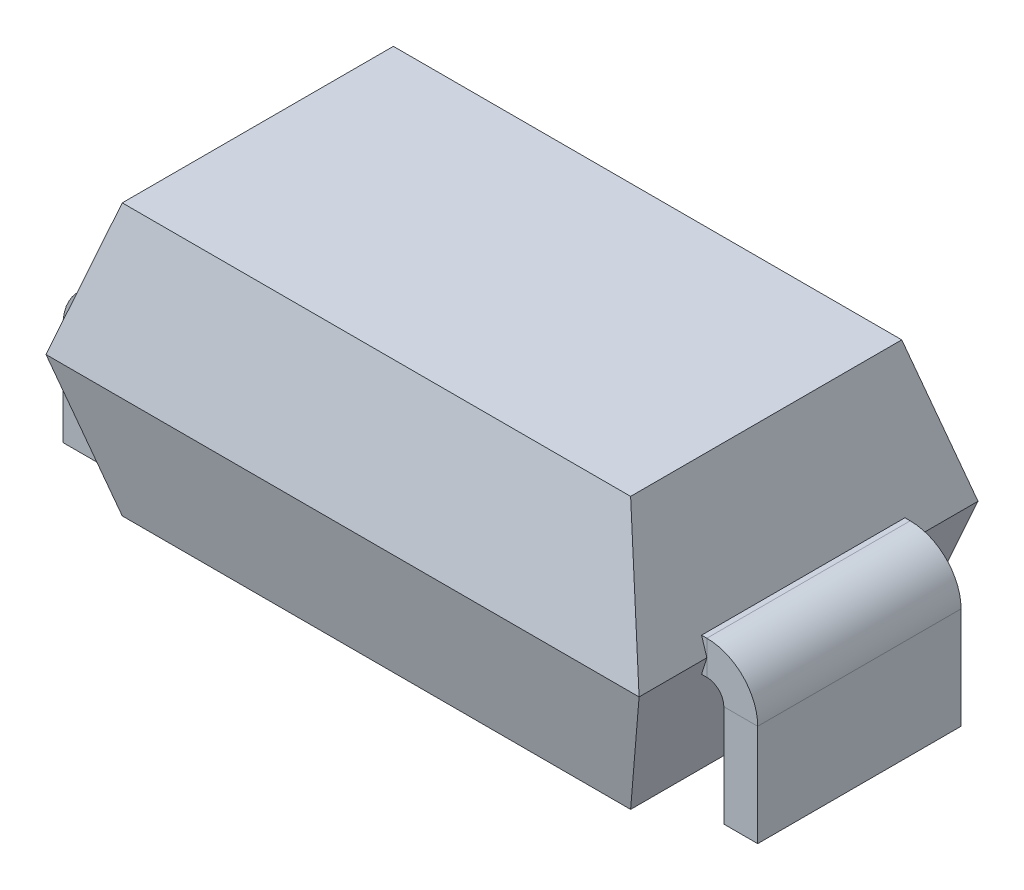
ISO-10303-21;
HEADER;
FILE_DESCRIPTION(('STEP AP214'),'2;1');
FILE_NAME('part.step','',(''),(''),'','','');
FILE_SCHEMA(('AUTOMOTIVE_DESIGN { 1 0 10303 214 1 1 1 1 }'));
ENDSEC;
DATA;
#1=APPLICATION_CONTEXT('core data for automotive mechanical design processes');
#2=APPLICATION_PROTOCOL_DEFINITION('international standard','automotive_design',2000,#1);
#3=PRODUCT_CONTEXT('',#1,'mechanical');
#4=PRODUCT('Part','Part','',(#3));
#5=PRODUCT_RELATED_PRODUCT_CATEGORY('part','',(#4));
#6=PRODUCT_DEFINITION_FORMATION('','',#4);
#7=PRODUCT_DEFINITION_CONTEXT('part definition',#1,'design');
#8=PRODUCT_DEFINITION('design','',#6,#7);
#9=PRODUCT_DEFINITION_SHAPE('','',#8);
#10=(LENGTH_UNIT() NAMED_UNIT(*) SI_UNIT(.MILLI.,.METRE.));
#11=(NAMED_UNIT(*) PLANE_ANGLE_UNIT() SI_UNIT($,.RADIAN.));
#12=(NAMED_UNIT(*) SI_UNIT($,.STERADIAN.) SOLID_ANGLE_UNIT());
#13=UNCERTAINTY_MEASURE_WITH_UNIT(LENGTH_MEASURE(1.E-05),#10,'distance_accuracy_value','');
#14=(GEOMETRIC_REPRESENTATION_CONTEXT(3) GLOBAL_UNCERTAINTY_ASSIGNED_CONTEXT((#13)) GLOBAL_UNIT_ASSIGNED_CONTEXT((#10,
#11,#12)) REPRESENTATION_CONTEXT('',''));
#15=CARTESIAN_POINT('',(0.,0.,0.));
#16=DIRECTION('',(0.,0.,1.));
#17=DIRECTION('',(1.,0.,0.));
#18=AXIS2_PLACEMENT_3D('',#15,#16,#17);
#19=CARTESIAN_POINT('',(0.,0.8,0.));
#20=DIRECTION('',(0.,1.,0.));
#21=DIRECTION('',(0.,0.,1.));
#22=AXIS2_PLACEMENT_3D('',#19,#20,#21);
#23=PLANE('',#22);
#24=DIRECTION('',(0.,0.,-1.));
#25=VECTOR('',#24,1.);
#26=CARTESIAN_POINT('',(1.5,0.8,-0.8));
#27=LINE('',#26,#25);
#28=CARTESIAN_POINT('',(1.5,0.8,0.8));
#29=VERTEX_POINT('',#28);
#30=CARTESIAN_POINT('',(1.5,0.8,-0.8));
#31=VERTEX_POINT('',#30);
#32=EDGE_CURVE('E567',#29,#31,#27,.T.);
#33=ORIENTED_EDGE('',*,*,#32,.T.);
#34=DIRECTION('',(-1.,0.,0.));
#35=VECTOR('',#34,1.);
#36=CARTESIAN_POINT('',(-1.5,0.8,-0.8));
#37=LINE('',#36,#35);
#38=CARTESIAN_POINT('',(-1.5,0.8,-0.8));
#39=VERTEX_POINT('',#38);
#40=EDGE_CURVE('E464',#31,#39,#37,.T.);
#41=ORIENTED_EDGE('',*,*,#40,.T.);
#42=DIRECTION('',(0.,0.,1.));
#43=VECTOR('',#42,1.);
#44=CARTESIAN_POINT('',(-1.5,0.8,-0.8));
#45=LINE('',#44,#43);
#46=CARTESIAN_POINT('',(-1.5,0.8,0.8));
#47=VERTEX_POINT('',#46);
#48=EDGE_CURVE('E687',#39,#47,#45,.T.);
#49=ORIENTED_EDGE('',*,*,#48,.T.);
#50=DIRECTION('',(1.,0.,0.));
#51=VECTOR('',#50,1.);
#52=CARTESIAN_POINT('',(-1.5,0.8,0.8));
#53=LINE('',#52,#51);
#54=EDGE_CURVE('E680',#47,#29,#53,.T.);
#55=ORIENTED_EDGE('',*,*,#54,.T.);
#56=EDGE_LOOP('',(#33,#41,#49,#55));
#57=FACE_BOUND('',#56,.T.);
#58=ADVANCED_FACE('F52',(#57),#23,.T.);
#59=CARTESIAN_POINT('',(-1.59430604982206,0.498220640569394,0.));
#60=DIRECTION('',(0.95447997803503,-0.298274993135946,0.));
#61=DIRECTION('',(0.298274993135946,0.95447997803503,0.));
#62=AXIS2_PLACEMENT_3D('',#59,#60,#61);
#63=PLANE('',#62);
#64=DIRECTION('',(0.,0.,1.));
#65=VECTOR('',#64,1.);
#66=CARTESIAN_POINT('',(-1.75,0.,-1.));
#67=LINE('',#66,#65);
#68=CARTESIAN_POINT('',(-1.75,0.,-1.));
#69=VERTEX_POINT('',#68);
#70=CARTESIAN_POINT('',(-1.75,0.,-0.6));
#71=VERTEX_POINT('',#70);
#72=EDGE_CURVE('E56',#69,#71,#67,.T.);
#73=ORIENTED_EDGE('',*,*,#72,.T.);
#74=DIRECTION('',(0.298274993135946,0.95447997803503,0.));
#75=VECTOR('',#74,1.);
#76=CARTESIAN_POINT('',(-1.59430604982206,0.498220640569394,-0.6));
#77=LINE('',#76,#75);
#78=CARTESIAN_POINT('',(-1.71875,0.1,-0.6));
#79=VERTEX_POINT('',#78);
#80=EDGE_CURVE('E249',#71,#79,#77,.T.);
#81=ORIENTED_EDGE('',*,*,#80,.T.);
#82=DIRECTION('',(0.,0.,1.));
#83=VECTOR('',#82,1.);
#84=CARTESIAN_POINT('',(-1.71875,0.1,0.));
#85=LINE('',#84,#83);
#86=CARTESIAN_POINT('',(-1.71875,0.1,0.6));
#87=VERTEX_POINT('',#86);
#88=EDGE_CURVE('E12',#79,#87,#85,.T.);
#89=ORIENTED_EDGE('',*,*,#88,.T.);
#90=DIRECTION('',(-0.298274993135946,-0.95447997803503,0.));
#91=VECTOR('',#90,1.);
#92=CARTESIAN_POINT('',(-1.59430604982206,0.498220640569394,0.6));
#93=LINE('',#92,#91);
#94=CARTESIAN_POINT('',(-1.75,0.,0.6));
#95=VERTEX_POINT('',#94);
#96=EDGE_CURVE('E259',#87,#95,#93,.T.);
#97=ORIENTED_EDGE('',*,*,#96,.T.);
#98=CARTESIAN_POINT('',(-1.75,0.,1.));
#99=VERTEX_POINT('',#98);
#100=EDGE_CURVE('E495',#95,#99,#67,.T.);
#101=ORIENTED_EDGE('',*,*,#100,.T.);
#102=DIRECTION('',(0.290129426592829,0.928414165097055,-0.232103541274263));
#103=VECTOR('',#102,1.);
#104=CARTESIAN_POINT('',(-1.75,0.,1.));
#105=LINE('',#104,#103);
#106=EDGE_CURVE('E497',#99,#47,#105,.T.);
#107=ORIENTED_EDGE('',*,*,#106,.T.);
#108=ORIENTED_EDGE('',*,*,#48,.F.);
#109=DIRECTION('',(0.29012942659283,0.928414165097055,0.232103541274264));
#110=VECTOR('',#109,1.);
#111=CARTESIAN_POINT('',(-1.75,0.,-1.));
#112=LINE('',#111,#110);
#113=EDGE_CURVE('E571',#69,#39,#112,.T.);
#114=ORIENTED_EDGE('',*,*,#113,.F.);
#115=EDGE_LOOP('',(#73,#81,#89,#97,#101,#107,#108,#114));
#116=FACE_BOUND('',#115,.T.);
#117=ADVANCED_FACE('F313',(#116),#63,.F.);
#118=CARTESIAN_POINT('',(0.,0.235294117647059,-0.941176470588236));
#119=DIRECTION('',(0.,-0.242535625036333,0.970142500145332));
#120=DIRECTION('',(0.,-0.970142500145332,-0.242535625036333));
#121=AXIS2_PLACEMENT_3D('',#118,#119,#120);
#122=PLANE('',#121);
#123=ORIENTED_EDGE('',*,*,#113,.T.);
#124=ORIENTED_EDGE('',*,*,#40,.F.);
#125=DIRECTION('',(-0.290129426592829,0.928414165097055,0.232103541274264));
#126=VECTOR('',#125,1.);
#127=CARTESIAN_POINT('',(1.75,0.,-1.));
#128=LINE('',#127,#126);
#129=CARTESIAN_POINT('',(1.75,0.,-1.));
#130=VERTEX_POINT('',#129);
#131=EDGE_CURVE('E560',#130,#31,#128,.T.);
#132=ORIENTED_EDGE('',*,*,#131,.F.);
#133=DIRECTION('',(-1.,0.,0.));
#134=VECTOR('',#133,1.);
#135=CARTESIAN_POINT('',(-1.75,0.,-1.));
#136=LINE('',#135,#134);
#137=EDGE_CURVE('E353',#130,#69,#136,.T.);
#138=ORIENTED_EDGE('',*,*,#137,.T.);
#139=EDGE_LOOP('',(#123,#124,#132,#138));
#140=FACE_BOUND('',#139,.T.);
#141=ADVANCED_FACE('F544',(#140),#122,.F.);
#142=CARTESIAN_POINT('',(0.,0.235294117647058,0.941176470588235));
#143=DIRECTION('',(0.,-0.242535625036332,-0.970142500145332));
#144=DIRECTION('',(0.,0.970142500145332,-0.242535625036332));
#145=AXIS2_PLACEMENT_3D('',#142,#143,#144);
#146=PLANE('',#145);
#147=DIRECTION('',(-0.29012942659283,0.928414165097055,-0.232103541274263));
#148=VECTOR('',#147,1.);
#149=CARTESIAN_POINT('',(1.75,0.,1.));
#150=LINE('',#149,#148);
#151=CARTESIAN_POINT('',(1.75,0.,1.));
#152=VERTEX_POINT('',#151);
#153=EDGE_CURVE('E568',#152,#29,#150,.T.);
#154=ORIENTED_EDGE('',*,*,#153,.T.);
#155=ORIENTED_EDGE('',*,*,#54,.F.);
#156=ORIENTED_EDGE('',*,*,#106,.F.);
#157=DIRECTION('',(1.,0.,0.));
#158=VECTOR('',#157,1.);
#159=CARTESIAN_POINT('',(-1.75,0.,1.));
#160=LINE('',#159,#158);
#161=EDGE_CURVE('E492',#99,#152,#160,.T.);
#162=ORIENTED_EDGE('',*,*,#161,.T.);
#163=EDGE_LOOP('',(#154,#155,#156,#162));
#164=FACE_BOUND('',#163,.T.);
#165=ADVANCED_FACE('F517',(#164),#146,.F.);
#166=CARTESIAN_POINT('',(1.59430604982206,0.498220640569394,0.));
#167=DIRECTION('',(-0.95447997803503,-0.298274993135946,0.));
#168=DIRECTION('',(0.298274993135946,-0.95447997803503,0.));
#169=AXIS2_PLACEMENT_3D('',#166,#167,#168);
#170=PLANE('',#169);
#171=DIRECTION('',(0.,0.,-1.));
#172=VECTOR('',#171,1.);
#173=CARTESIAN_POINT('',(1.75,0.,-1.));
#174=LINE('',#173,#172);
#175=CARTESIAN_POINT('',(1.75,0.,0.6));
#176=VERTEX_POINT('',#175);
#177=EDGE_CURVE('E480',#152,#176,#174,.T.);
#178=ORIENTED_EDGE('',*,*,#177,.T.);
#179=DIRECTION('',(-0.298274993135946,0.95447997803503,0.));
#180=VECTOR('',#179,1.);
#181=CARTESIAN_POINT('',(1.59430604982206,0.498220640569394,0.6));
#182=LINE('',#181,#180);
#183=CARTESIAN_POINT('',(1.71875,0.1,0.6));
#184=VERTEX_POINT('',#183);
#185=EDGE_CURVE('E339',#176,#184,#182,.T.);
#186=ORIENTED_EDGE('',*,*,#185,.T.);
#187=DIRECTION('',(0.,0.,-1.));
#188=VECTOR('',#187,1.);
#189=CARTESIAN_POINT('',(1.71875,0.1,0.));
#190=LINE('',#189,#188);
#191=CARTESIAN_POINT('',(1.71875,0.1,-0.6));
#192=VERTEX_POINT('',#191);
#193=EDGE_CURVE('E472',#184,#192,#190,.T.);
#194=ORIENTED_EDGE('',*,*,#193,.T.);
#195=DIRECTION('',(0.298274993135946,-0.95447997803503,0.));
#196=VECTOR('',#195,1.);
#197=CARTESIAN_POINT('',(1.59430604982206,0.498220640569394,-0.6));
#198=LINE('',#197,#196);
#199=CARTESIAN_POINT('',(1.75,0.,-0.6));
#200=VERTEX_POINT('',#199);
#201=EDGE_CURVE('E336',#192,#200,#198,.T.);
#202=ORIENTED_EDGE('',*,*,#201,.T.);
#203=EDGE_CURVE('E458',#200,#130,#174,.T.);
#204=ORIENTED_EDGE('',*,*,#203,.T.);
#205=ORIENTED_EDGE('',*,*,#131,.T.);
#206=ORIENTED_EDGE('',*,*,#32,.F.);
#207=ORIENTED_EDGE('',*,*,#153,.F.);
#208=EDGE_LOOP('',(#178,#186,#194,#202,#204,#205,#206,#207));
#209=FACE_BOUND('',#208,.T.);
#210=ADVANCED_FACE('F508',(#209),#170,.F.);
#211=CARTESIAN_POINT('',(0.,-0.8,0.));
#212=DIRECTION('',(0.,-1.,0.));
#213=DIRECTION('',(0.,0.,1.));
#214=AXIS2_PLACEMENT_3D('',#211,#212,#213);
#215=PLANE('',#214);
#216=DIRECTION('',(0.,0.,-1.));
#217=VECTOR('',#216,1.);
#218=CARTESIAN_POINT('',(1.5,-0.8,-0.8));
#219=LINE('',#218,#217);
#220=CARTESIAN_POINT('',(1.5,-0.8,0.8));
#221=VERTEX_POINT('',#220);
#222=CARTESIAN_POINT('',(1.5,-0.8,-0.8));
#223=VERTEX_POINT('',#222);
#224=EDGE_CURVE('E422',#221,#223,#219,.T.);
#225=ORIENTED_EDGE('',*,*,#224,.F.);
#226=DIRECTION('',(1.,0.,0.));
#227=VECTOR('',#226,1.);
#228=CARTESIAN_POINT('',(-1.5,-0.8,0.8));
#229=LINE('',#228,#227);
#230=CARTESIAN_POINT('',(-1.5,-0.8,0.8));
#231=VERTEX_POINT('',#230);
#232=EDGE_CURVE('E408',#231,#221,#229,.T.);
#233=ORIENTED_EDGE('',*,*,#232,.F.);
#234=DIRECTION('',(0.,0.,1.));
#235=VECTOR('',#234,1.);
#236=CARTESIAN_POINT('',(-1.5,-0.8,-0.8));
#237=LINE('',#236,#235);
#238=CARTESIAN_POINT('',(-1.5,-0.8,-0.8));
#239=VERTEX_POINT('',#238);
#240=EDGE_CURVE('E395',#239,#231,#237,.T.);
#241=ORIENTED_EDGE('',*,*,#240,.F.);
#242=DIRECTION('',(-1.,0.,0.));
#243=VECTOR('',#242,1.);
#244=CARTESIAN_POINT('',(-1.5,-0.8,-0.8));
#245=LINE('',#244,#243);
#246=EDGE_CURVE('E481',#223,#239,#245,.T.);
#247=ORIENTED_EDGE('',*,*,#246,.F.);
#248=EDGE_LOOP('',(#225,#233,#241,#247));
#249=FACE_BOUND('',#248,.T.);
#250=ADVANCED_FACE('F438',(#249),#215,.T.);
#251=CARTESIAN_POINT('',(-1.59430604982206,-0.498220640569394,0.));
#252=DIRECTION('',(0.95447997803503,0.298274993135946,0.));
#253=DIRECTION('',(0.298274993135946,-0.95447997803503,0.));
#254=AXIS2_PLACEMENT_3D('',#251,#252,#253);
#255=PLANE('',#254);
#256=DIRECTION('',(0.,0.,-1.));
#257=VECTOR('',#256,1.);
#258=CARTESIAN_POINT('',(-1.71875,-0.1,0.));
#259=LINE('',#258,#257);
#260=CARTESIAN_POINT('',(-1.71875,-0.1,0.6));
#261=VERTEX_POINT('',#260);
#262=CARTESIAN_POINT('',(-1.71875,-0.0999999999999999,-0.6));
#263=VERTEX_POINT('',#262);
#264=EDGE_CURVE('E933',#261,#263,#259,.T.);
#265=ORIENTED_EDGE('',*,*,#264,.T.);
#266=DIRECTION('',(-0.298274993135946,0.95447997803503,0.));
#267=VECTOR('',#266,1.);
#268=CARTESIAN_POINT('',(-1.59430604982206,-0.498220640569394,-0.6));
#269=LINE('',#268,#267);
#270=EDGE_CURVE('E62',#263,#71,#269,.T.);
#271=ORIENTED_EDGE('',*,*,#270,.T.);
#272=ORIENTED_EDGE('',*,*,#72,.F.);
#273=DIRECTION('',(0.29012942659283,-0.928414165097055,0.232103541274264));
#274=VECTOR('',#273,1.);
#275=CARTESIAN_POINT('',(-1.75,0.,-1.));
#276=LINE('',#275,#274);
#277=EDGE_CURVE('E603',#69,#239,#276,.T.);
#278=ORIENTED_EDGE('',*,*,#277,.T.);
#279=ORIENTED_EDGE('',*,*,#240,.T.);
#280=DIRECTION('',(0.290129426592829,-0.928414165097055,-0.232103541274263));
#281=VECTOR('',#280,1.);
#282=CARTESIAN_POINT('',(-1.75,0.,1.));
#283=LINE('',#282,#281);
#284=EDGE_CURVE('E345',#99,#231,#283,.T.);
#285=ORIENTED_EDGE('',*,*,#284,.F.);
#286=ORIENTED_EDGE('',*,*,#100,.F.);
#287=DIRECTION('',(0.298274993135946,-0.95447997803503,0.));
#288=VECTOR('',#287,1.);
#289=CARTESIAN_POINT('',(-1.59430604982206,-0.498220640569394,0.6));
#290=LINE('',#289,#288);
#291=EDGE_CURVE('E477',#95,#261,#290,.T.);
#292=ORIENTED_EDGE('',*,*,#291,.T.);
#293=EDGE_LOOP('',(#265,#271,#272,#278,#279,#285,#286,#292));
#294=FACE_BOUND('',#293,.T.);
#295=ADVANCED_FACE('F372',(#294),#255,.F.);
#296=CARTESIAN_POINT('',(0.,-0.235294117647059,-0.941176470588236));
#297=DIRECTION('',(0.,0.242535625036333,0.970142500145332));
#298=DIRECTION('',(0.,0.970142500145332,-0.242535625036333));
#299=AXIS2_PLACEMENT_3D('',#296,#297,#298);
#300=PLANE('',#299);
#301=ORIENTED_EDGE('',*,*,#277,.F.);
#302=ORIENTED_EDGE('',*,*,#137,.F.);
#303=DIRECTION('',(-0.290129426592829,-0.928414165097055,0.232103541274264));
#304=VECTOR('',#303,1.);
#305=CARTESIAN_POINT('',(1.75,0.,-1.));
#306=LINE('',#305,#304);
#307=EDGE_CURVE('E359',#130,#223,#306,.T.);
#308=ORIENTED_EDGE('',*,*,#307,.T.);
#309=ORIENTED_EDGE('',*,*,#246,.T.);
#310=EDGE_LOOP('',(#301,#302,#308,#309));
#311=FACE_BOUND('',#310,.T.);
#312=ADVANCED_FACE('F361',(#311),#300,.F.);
#313=CARTESIAN_POINT('',(0.,-0.235294117647058,0.941176470588235));
#314=DIRECTION('',(0.,0.242535625036332,-0.970142500145332));
#315=DIRECTION('',(0.,-0.970142500145332,-0.242535625036332));
#316=AXIS2_PLACEMENT_3D('',#313,#314,#315);
#317=PLANE('',#316);
#318=DIRECTION('',(-0.29012942659283,-0.928414165097055,-0.232103541274263));
#319=VECTOR('',#318,1.);
#320=CARTESIAN_POINT('',(1.75,0.,1.));
#321=LINE('',#320,#319);
#322=EDGE_CURVE('E612',#152,#221,#321,.T.);
#323=ORIENTED_EDGE('',*,*,#322,.F.);
#324=ORIENTED_EDGE('',*,*,#161,.F.);
#325=ORIENTED_EDGE('',*,*,#284,.T.);
#326=ORIENTED_EDGE('',*,*,#232,.T.);
#327=EDGE_LOOP('',(#323,#324,#325,#326));
#328=FACE_BOUND('',#327,.T.);
#329=ADVANCED_FACE('F371',(#328),#317,.F.);
#330=CARTESIAN_POINT('',(1.59430604982206,-0.498220640569394,0.));
#331=DIRECTION('',(-0.95447997803503,0.298274993135946,0.));
#332=DIRECTION('',(0.298274993135946,0.95447997803503,0.));
#333=AXIS2_PLACEMENT_3D('',#330,#331,#332);
#334=PLANE('',#333);
#335=DIRECTION('',(0.,0.,1.));
#336=VECTOR('',#335,1.);
#337=CARTESIAN_POINT('',(1.71875,-0.1,0.));
#338=LINE('',#337,#336);
#339=CARTESIAN_POINT('',(1.71875,-0.0999999999999999,-0.6));
#340=VERTEX_POINT('',#339);
#341=CARTESIAN_POINT('',(1.71875,-0.1,0.6));
#342=VERTEX_POINT('',#341);
#343=EDGE_CURVE('E463',#340,#342,#338,.T.);
#344=ORIENTED_EDGE('',*,*,#343,.T.);
#345=DIRECTION('',(0.298274993135946,0.95447997803503,0.));
#346=VECTOR('',#345,1.);
#347=CARTESIAN_POINT('',(1.59430604982206,-0.498220640569394,0.6));
#348=LINE('',#347,#346);
#349=EDGE_CURVE('E469',#342,#176,#348,.T.);
#350=ORIENTED_EDGE('',*,*,#349,.T.);
#351=ORIENTED_EDGE('',*,*,#177,.F.);
#352=ORIENTED_EDGE('',*,*,#322,.T.);
#353=ORIENTED_EDGE('',*,*,#224,.T.);
#354=ORIENTED_EDGE('',*,*,#307,.F.);
#355=ORIENTED_EDGE('',*,*,#203,.F.);
#356=DIRECTION('',(-0.298274993135946,-0.95447997803503,0.));
#357=VECTOR('',#356,1.);
#358=CARTESIAN_POINT('',(1.59430604982206,-0.498220640569394,-0.6));
#359=LINE('',#358,#357);
#360=EDGE_CURVE('E461',#200,#340,#359,.T.);
#361=ORIENTED_EDGE('',*,*,#360,.T.);
#362=EDGE_LOOP('',(#344,#350,#351,#352,#353,#354,#355,#361));
#363=FACE_BOUND('',#362,.T.);
#364=ADVANCED_FACE('F428',(#363),#334,.F.);
#365=CARTESIAN_POINT('',(1.55,0.1,-0.6));
#366=DIRECTION('',(0.,1.,0.));
#367=DIRECTION('',(0.,0.,1.));
#368=AXIS2_PLACEMENT_3D('',#365,#366,#367);
#369=PLANE('',#368);
#370=ORIENTED_EDGE('',*,*,#193,.F.);
#371=DIRECTION('',(1.,0.,0.));
#372=VECTOR('',#371,1.);
#373=CARTESIAN_POINT('',(1.55,0.1,0.6));
#374=LINE('',#373,#372);
#375=CARTESIAN_POINT('',(1.75,0.1,0.6));
#376=VERTEX_POINT('',#375);
#377=EDGE_CURVE('E317',#184,#376,#374,.T.);
#378=ORIENTED_EDGE('',*,*,#377,.T.);
#379=DIRECTION('',(0.,0.,1.));
#380=VECTOR('',#379,1.);
#381=CARTESIAN_POINT('',(1.75,0.1,-0.6));
#382=LINE('',#381,#380);
#383=CARTESIAN_POINT('',(1.75,0.1,-0.6));
#384=VERTEX_POINT('',#383);
#385=EDGE_CURVE('E776',#384,#376,#382,.T.);
#386=ORIENTED_EDGE('',*,*,#385,.F.);
#387=DIRECTION('',(1.,0.,0.));
#388=VECTOR('',#387,1.);
#389=CARTESIAN_POINT('',(1.55,0.1,-0.6));
#390=LINE('',#389,#388);
#391=EDGE_CURVE('E766',#192,#384,#390,.T.);
#392=ORIENTED_EDGE('',*,*,#391,.F.);
#393=EDGE_LOOP('',(#370,#378,#386,#392));
#394=FACE_BOUND('',#393,.T.);
#395=ADVANCED_FACE('F437',(#394),#369,.T.);
#396=CARTESIAN_POINT('',(1.55,0.1,0.6));
#397=DIRECTION('',(0.,0.,1.));
#398=DIRECTION('',(1.,0.,0.));
#399=AXIS2_PLACEMENT_3D('',#396,#397,#398);
#400=PLANE('',#399);
#401=ORIENTED_EDGE('',*,*,#185,.F.);
#402=DIRECTION('',(0.,-1.,0.));
#403=VECTOR('',#402,1.);
#404=CARTESIAN_POINT('',(1.75,0.1,0.6));
#405=LINE('',#404,#403);
#406=EDGE_CURVE('E333',#376,#176,#405,.T.);
#407=ORIENTED_EDGE('',*,*,#406,.F.);
#408=ORIENTED_EDGE('',*,*,#377,.F.);
#409=EDGE_LOOP('',(#401,#407,#408));
#410=FACE_BOUND('',#409,.T.);
#411=ADVANCED_FACE('F833',(#410),#400,.T.);
#412=ORIENTED_EDGE('',*,*,#349,.F.);
#413=DIRECTION('',(1.,0.,0.));
#414=VECTOR('',#413,1.);
#415=CARTESIAN_POINT('',(1.55,-0.1,0.6));
#416=LINE('',#415,#414);
#417=CARTESIAN_POINT('',(1.75,-0.1,0.6));
#418=VERTEX_POINT('',#417);
#419=EDGE_CURVE('E328',#342,#418,#416,.T.);
#420=ORIENTED_EDGE('',*,*,#419,.T.);
#421=EDGE_CURVE('E319',#176,#418,#405,.T.);
#422=ORIENTED_EDGE('',*,*,#421,.F.);
#423=EDGE_LOOP('',(#412,#420,#422));
#424=FACE_BOUND('',#423,.T.);
#425=ADVANCED_FACE('F733',(#424),#400,.T.);
#426=CARTESIAN_POINT('',(1.55,-0.0999999999999999,-0.6));
#427=DIRECTION('',(0.,-1.,0.));
#428=DIRECTION('',(0.,0.,-1.));
#429=AXIS2_PLACEMENT_3D('',#426,#427,#428);
#430=PLANE('',#429);
#431=ORIENTED_EDGE('',*,*,#343,.F.);
#432=DIRECTION('',(1.,0.,0.));
#433=VECTOR('',#432,1.);
#434=CARTESIAN_POINT('',(1.55,-0.0999999999999999,-0.6));
#435=LINE('',#434,#433);
#436=CARTESIAN_POINT('',(1.75,-0.0999999999999999,-0.6));
#437=VERTEX_POINT('',#436);
#438=EDGE_CURVE('E78',#340,#437,#435,.T.);
#439=ORIENTED_EDGE('',*,*,#438,.T.);
#440=DIRECTION('',(0.,0.,-1.));
#441=VECTOR('',#440,1.);
#442=CARTESIAN_POINT('',(1.75,-0.0999999999999999,-0.6));
#443=LINE('',#442,#441);
#444=EDGE_CURVE('E739',#418,#437,#443,.T.);
#445=ORIENTED_EDGE('',*,*,#444,.F.);
#446=ORIENTED_EDGE('',*,*,#419,.F.);
#447=EDGE_LOOP('',(#431,#439,#445,#446));
#448=FACE_BOUND('',#447,.T.);
#449=ADVANCED_FACE('F737',(#448),#430,.T.);
#450=CARTESIAN_POINT('',(1.55,0.1,-0.6));
#451=DIRECTION('',(0.,0.,-1.));
#452=DIRECTION('',(-1.,0.,0.));
#453=AXIS2_PLACEMENT_3D('',#450,#451,#452);
#454=PLANE('',#453);
#455=ORIENTED_EDGE('',*,*,#201,.F.);
#456=ORIENTED_EDGE('',*,*,#391,.T.);
#457=DIRECTION('',(0.,1.,0.));
#458=VECTOR('',#457,1.);
#459=CARTESIAN_POINT('',(1.75,0.1,-0.6));
#460=LINE('',#459,#458);
#461=EDGE_CURVE('E744',#200,#384,#460,.T.);
#462=ORIENTED_EDGE('',*,*,#461,.F.);
#463=EDGE_LOOP('',(#455,#456,#462));
#464=FACE_BOUND('',#463,.T.);
#465=ADVANCED_FACE('F852',(#464),#454,.T.);
#466=ORIENTED_EDGE('',*,*,#360,.F.);
#467=EDGE_CURVE('E771',#437,#200,#460,.T.);
#468=ORIENTED_EDGE('',*,*,#467,.F.);
#469=ORIENTED_EDGE('',*,*,#438,.F.);
#470=EDGE_LOOP('',(#466,#468,#469));
#471=FACE_BOUND('',#470,.T.);
#472=ADVANCED_FACE('F859',(#471),#454,.T.);
#473=CARTESIAN_POINT('',(1.95,-0.8,0.));
#474=DIRECTION('',(0.,1.,0.));
#475=DIRECTION('',(0.,0.,1.));
#476=AXIS2_PLACEMENT_3D('',#473,#474,#475);
#477=PLANE('',#476);
#478=DIRECTION('',(-1.,0.,0.));
#479=VECTOR('',#478,1.);
#480=CARTESIAN_POINT('',(2.05,-0.8,0.6));
#481=LINE('',#480,#479);
#482=CARTESIAN_POINT('',(2.05,-0.8,0.6));
#483=VERTEX_POINT('',#482);
#484=CARTESIAN_POINT('',(1.85,-0.8,0.6));
#485=VERTEX_POINT('',#484);
#486=EDGE_CURVE('E823',#483,#485,#481,.T.);
#487=ORIENTED_EDGE('',*,*,#486,.T.);
#488=DIRECTION('',(0.,0.,-1.));
#489=VECTOR('',#488,1.);
#490=CARTESIAN_POINT('',(1.85,-0.8,-0.6));
#491=LINE('',#490,#489);
#492=CARTESIAN_POINT('',(1.85,-0.8,-0.6));
#493=VERTEX_POINT('',#492);
#494=EDGE_CURVE('E757',#485,#493,#491,.T.);
#495=ORIENTED_EDGE('',*,*,#494,.T.);
#496=DIRECTION('',(1.,0.,0.));
#497=VECTOR('',#496,1.);
#498=CARTESIAN_POINT('',(2.05,-0.8,-0.6));
#499=LINE('',#498,#497);
#500=CARTESIAN_POINT('',(2.05,-0.8,-0.6));
#501=VERTEX_POINT('',#500);
#502=EDGE_CURVE('E763',#493,#501,#499,.T.);
#503=ORIENTED_EDGE('',*,*,#502,.T.);
#504=DIRECTION('',(0.,0.,1.));
#505=VECTOR('',#504,1.);
#506=CARTESIAN_POINT('',(2.05,-0.8,-0.6));
#507=LINE('',#506,#505);
#508=EDGE_CURVE('E340',#501,#483,#507,.T.);
#509=ORIENTED_EDGE('',*,*,#508,.T.);
#510=EDGE_LOOP('',(#487,#495,#503,#509));
#511=FACE_BOUND('',#510,.T.);
#512=ADVANCED_FACE('F847',(#511),#477,.F.);
#513=CARTESIAN_POINT('',(1.75,0.1,0.6));
#514=DIRECTION('',(0.,0.,1.));
#515=DIRECTION('',(1.,0.,0.));
#516=AXIS2_PLACEMENT_3D('',#513,#514,#515);
#517=PLANE('',#516);
#518=CARTESIAN_POINT('',(1.75,-0.2,0.6));
#519=DIRECTION('',(0.,0.,-1.));
#520=DIRECTION('',(0.,1.,0.));
#521=AXIS2_PLACEMENT_3D('',#518,#519,#520);
#522=CIRCLE('',#521,0.1);
#523=CARTESIAN_POINT('',(1.85,-0.2,0.6));
#524=VERTEX_POINT('',#523);
#525=EDGE_CURVE('E754',#418,#524,#522,.T.);
#526=ORIENTED_EDGE('',*,*,#525,.T.);
#527=DIRECTION('',(-1.,0.,0.));
#528=VECTOR('',#527,1.);
#529=CARTESIAN_POINT('',(2.05,-0.2,0.6));
#530=LINE('',#529,#528);
#531=CARTESIAN_POINT('',(2.05,-0.2,0.6));
#532=VERTEX_POINT('',#531);
#533=EDGE_CURVE('E801',#532,#524,#530,.T.);
#534=ORIENTED_EDGE('',*,*,#533,.F.);
#535=CARTESIAN_POINT('',(1.75,-0.2,0.6));
#536=DIRECTION('',(0.,0.,-1.));
#537=DIRECTION('',(0.,1.,0.));
#538=AXIS2_PLACEMENT_3D('',#535,#536,#537);
#539=CIRCLE('',#538,0.3);
#540=EDGE_CURVE('E799',#376,#532,#539,.T.);
#541=ORIENTED_EDGE('',*,*,#540,.F.);
#542=ORIENTED_EDGE('',*,*,#406,.T.);
#543=ORIENTED_EDGE('',*,*,#421,.T.);
#544=EDGE_LOOP('',(#526,#534,#541,#542,#543));
#545=FACE_BOUND('',#544,.T.);
#546=ADVANCED_FACE('F831',(#545),#517,.T.);
#547=CARTESIAN_POINT('',(1.75,-0.2,0.));
#548=DIRECTION('',(0.,0.,-1.));
#549=DIRECTION('',(-1.,0.,0.));
#550=AXIS2_PLACEMENT_3D('',#547,#548,#549);
#551=CYLINDRICAL_SURFACE('',#550,0.1);
#552=CARTESIAN_POINT('',(1.75,-0.2,-0.6));
#553=DIRECTION('',(0.,0.,-1.));
#554=DIRECTION('',(0.,1.,0.));
#555=AXIS2_PLACEMENT_3D('',#552,#553,#554);
#556=CIRCLE('',#555,0.1);
#557=CARTESIAN_POINT('',(1.85,-0.2,-0.6));
#558=VERTEX_POINT('',#557);
#559=EDGE_CURVE('E753',#437,#558,#556,.T.);
#560=ORIENTED_EDGE('',*,*,#559,.T.);
#561=DIRECTION('',(0.,0.,-1.));
#562=VECTOR('',#561,1.);
#563=CARTESIAN_POINT('',(1.85,-0.2,-0.6));
#564=LINE('',#563,#562);
#565=EDGE_CURVE('E750',#524,#558,#564,.T.);
#566=ORIENTED_EDGE('',*,*,#565,.F.);
#567=ORIENTED_EDGE('',*,*,#525,.F.);
#568=ORIENTED_EDGE('',*,*,#444,.T.);
#569=EDGE_LOOP('',(#560,#566,#567,#568));
#570=FACE_BOUND('',#569,.T.);
#571=ADVANCED_FACE('F815',(#570),#551,.F.);
#572=CARTESIAN_POINT('',(1.75,0.1,-0.6));
#573=DIRECTION('',(0.,0.,-1.));
#574=DIRECTION('',(-1.,0.,0.));
#575=AXIS2_PLACEMENT_3D('',#572,#573,#574);
#576=PLANE('',#575);
#577=CARTESIAN_POINT('',(1.75,-0.2,-0.6));
#578=DIRECTION('',(0.,0.,-1.));
#579=DIRECTION('',(0.,1.,0.));
#580=AXIS2_PLACEMENT_3D('',#577,#578,#579);
#581=CIRCLE('',#580,0.3);
#582=CARTESIAN_POINT('',(2.05,-0.2,-0.6));
#583=VERTEX_POINT('',#582);
#584=EDGE_CURVE('E782',#384,#583,#581,.T.);
#585=ORIENTED_EDGE('',*,*,#584,.T.);
#586=DIRECTION('',(1.,0.,0.));
#587=VECTOR('',#586,1.);
#588=CARTESIAN_POINT('',(2.05,-0.2,-0.6));
#589=LINE('',#588,#587);
#590=EDGE_CURVE('E756',#558,#583,#589,.T.);
#591=ORIENTED_EDGE('',*,*,#590,.F.);
#592=ORIENTED_EDGE('',*,*,#559,.F.);
#593=ORIENTED_EDGE('',*,*,#467,.T.);
#594=ORIENTED_EDGE('',*,*,#461,.T.);
#595=EDGE_LOOP('',(#585,#591,#592,#593,#594));
#596=FACE_BOUND('',#595,.T.);
#597=ADVANCED_FACE('F780',(#596),#576,.T.);
#598=CARTESIAN_POINT('',(1.75,-0.2,0.));
#599=DIRECTION('',(0.,0.,-1.));
#600=DIRECTION('',(-1.,0.,0.));
#601=AXIS2_PLACEMENT_3D('',#598,#599,#600);
#602=CYLINDRICAL_SURFACE('',#601,0.3);
#603=DIRECTION('',(0.,0.,1.));
#604=VECTOR('',#603,1.);
#605=CARTESIAN_POINT('',(2.05,-0.2,-0.6));
#606=LINE('',#605,#604);
#607=EDGE_CURVE('E793',#583,#532,#606,.T.);
#608=ORIENTED_EDGE('',*,*,#607,.F.);
#609=ORIENTED_EDGE('',*,*,#584,.F.);
#610=ORIENTED_EDGE('',*,*,#385,.T.);
#611=ORIENTED_EDGE('',*,*,#540,.T.);
#612=EDGE_LOOP('',(#608,#609,#610,#611));
#613=FACE_BOUND('',#612,.T.);
#614=ADVANCED_FACE('F789',(#613),#602,.T.);
#615=CARTESIAN_POINT('',(2.05,-0.2,0.6));
#616=DIRECTION('',(0.,0.,1.));
#617=DIRECTION('',(1.,0.,0.));
#618=AXIS2_PLACEMENT_3D('',#615,#616,#617);
#619=PLANE('',#618);
#620=DIRECTION('',(0.,-1.,0.));
#621=VECTOR('',#620,1.);
#622=CARTESIAN_POINT('',(1.85,-0.2,0.6));
#623=LINE('',#622,#621);
#624=EDGE_CURVE('E760',#524,#485,#623,.T.);
#625=ORIENTED_EDGE('',*,*,#624,.T.);
#626=ORIENTED_EDGE('',*,*,#486,.F.);
#627=DIRECTION('',(0.,-1.,0.));
#628=VECTOR('',#627,1.);
#629=CARTESIAN_POINT('',(2.05,-0.2,0.6));
#630=LINE('',#629,#628);
#631=EDGE_CURVE('E747',#532,#483,#630,.T.);
#632=ORIENTED_EDGE('',*,*,#631,.F.);
#633=ORIENTED_EDGE('',*,*,#533,.T.);
#634=EDGE_LOOP('',(#625,#626,#632,#633));
#635=FACE_BOUND('',#634,.T.);
#636=ADVANCED_FACE('F828',(#635),#619,.T.);
#637=CARTESIAN_POINT('',(1.85,-0.2,-0.6));
#638=DIRECTION('',(-1.,0.,0.));
#639=DIRECTION('',(0.,-1.,0.));
#640=AXIS2_PLACEMENT_3D('',#637,#638,#639);
#641=PLANE('',#640);
#642=DIRECTION('',(0.,-1.,0.));
#643=VECTOR('',#642,1.);
#644=CARTESIAN_POINT('',(1.85,-0.2,-0.6));
#645=LINE('',#644,#643);
#646=EDGE_CURVE('E759',#558,#493,#645,.T.);
#647=ORIENTED_EDGE('',*,*,#646,.T.);
#648=ORIENTED_EDGE('',*,*,#494,.F.);
#649=ORIENTED_EDGE('',*,*,#624,.F.);
#650=ORIENTED_EDGE('',*,*,#565,.T.);
#651=EDGE_LOOP('',(#647,#648,#649,#650));
#652=FACE_BOUND('',#651,.T.);
#653=ADVANCED_FACE('F818',(#652),#641,.T.);
#654=CARTESIAN_POINT('',(2.05,-0.2,-0.6));
#655=DIRECTION('',(0.,0.,-1.));
#656=DIRECTION('',(-1.,0.,0.));
#657=AXIS2_PLACEMENT_3D('',#654,#655,#656);
#658=PLANE('',#657);
#659=DIRECTION('',(0.,-1.,0.));
#660=VECTOR('',#659,1.);
#661=CARTESIAN_POINT('',(2.05,-0.2,-0.6));
#662=LINE('',#661,#660);
#663=EDGE_CURVE('E805',#583,#501,#662,.T.);
#664=ORIENTED_EDGE('',*,*,#663,.T.);
#665=ORIENTED_EDGE('',*,*,#502,.F.);
#666=ORIENTED_EDGE('',*,*,#646,.F.);
#667=ORIENTED_EDGE('',*,*,#590,.T.);
#668=EDGE_LOOP('',(#664,#665,#666,#667));
#669=FACE_BOUND('',#668,.T.);
#670=ADVANCED_FACE('F813',(#669),#658,.T.);
#671=CARTESIAN_POINT('',(2.05,-0.2,-0.6));
#672=DIRECTION('',(1.,0.,0.));
#673=DIRECTION('',(0.,1.,0.));
#674=AXIS2_PLACEMENT_3D('',#671,#672,#673);
#675=PLANE('',#674);
#676=ORIENTED_EDGE('',*,*,#508,.F.);
#677=ORIENTED_EDGE('',*,*,#663,.F.);
#678=ORIENTED_EDGE('',*,*,#607,.T.);
#679=ORIENTED_EDGE('',*,*,#631,.T.);
#680=EDGE_LOOP('',(#676,#677,#678,#679));
#681=FACE_BOUND('',#680,.T.);
#682=ADVANCED_FACE('F863',(#681),#675,.T.);
#683=CARTESIAN_POINT('',(-1.55,0.1,-0.6));
#684=DIRECTION('',(0.,1.,0.));
#685=DIRECTION('',(0.,0.,1.));
#686=AXIS2_PLACEMENT_3D('',#683,#684,#685);
#687=PLANE('',#686);
#688=ORIENTED_EDGE('',*,*,#88,.F.);
#689=DIRECTION('',(-1.,0.,0.));
#690=VECTOR('',#689,1.);
#691=CARTESIAN_POINT('',(-1.55,0.1,-0.6));
#692=LINE('',#691,#690);
#693=CARTESIAN_POINT('',(-1.75,0.1,-0.6));
#694=VERTEX_POINT('',#693);
#695=EDGE_CURVE('E216',#79,#694,#692,.T.);
#696=ORIENTED_EDGE('',*,*,#695,.T.);
#697=DIRECTION('',(0.,0.,1.));
#698=VECTOR('',#697,1.);
#699=CARTESIAN_POINT('',(-1.75,0.1,-0.6));
#700=LINE('',#699,#698);
#701=CARTESIAN_POINT('',(-1.75,0.1,0.6));
#702=VERTEX_POINT('',#701);
#703=EDGE_CURVE('E221',#702,#694,#700,.F.);
#704=ORIENTED_EDGE('',*,*,#703,.F.);
#705=DIRECTION('',(-1.,0.,0.));
#706=VECTOR('',#705,1.);
#707=CARTESIAN_POINT('',(-1.55,0.1,0.6));
#708=LINE('',#707,#706);
#709=EDGE_CURVE('E246',#87,#702,#708,.T.);
#710=ORIENTED_EDGE('',*,*,#709,.F.);
#711=EDGE_LOOP('',(#688,#696,#704,#710));
#712=FACE_BOUND('',#711,.T.);
#713=ADVANCED_FACE('F218',(#712),#687,.T.);
#714=CARTESIAN_POINT('',(-1.55,0.1,-0.6));
#715=DIRECTION('',(0.,0.,-1.));
#716=DIRECTION('',(-1.,0.,0.));
#717=AXIS2_PLACEMENT_3D('',#714,#715,#716);
#718=PLANE('',#717);
#719=ORIENTED_EDGE('',*,*,#80,.F.);
#720=DIRECTION('',(0.,1.,0.));
#721=VECTOR('',#720,1.);
#722=CARTESIAN_POINT('',(-1.75,0.1,-0.6));
#723=LINE('',#722,#721);
#724=EDGE_CURVE('E235',#694,#71,#723,.F.);
#725=ORIENTED_EDGE('',*,*,#724,.F.);
#726=ORIENTED_EDGE('',*,*,#695,.F.);
#727=EDGE_LOOP('',(#719,#725,#726));
#728=FACE_BOUND('',#727,.T.);
#729=ADVANCED_FACE('F248',(#728),#718,.T.);
#730=ORIENTED_EDGE('',*,*,#270,.F.);
#731=DIRECTION('',(-1.,0.,0.));
#732=VECTOR('',#731,1.);
#733=CARTESIAN_POINT('',(-1.55,-0.0999999999999999,-0.6));
#734=LINE('',#733,#732);
#735=CARTESIAN_POINT('',(-1.75,-0.0999999999999999,-0.6));
#736=VERTEX_POINT('',#735);
#737=EDGE_CURVE('E251',#263,#736,#734,.T.);
#738=ORIENTED_EDGE('',*,*,#737,.T.);
#739=EDGE_CURVE('E225',#71,#736,#723,.F.);
#740=ORIENTED_EDGE('',*,*,#739,.F.);
#741=EDGE_LOOP('',(#730,#738,#740));
#742=FACE_BOUND('',#741,.T.);
#743=ADVANCED_FACE('F878',(#742),#718,.T.);
#744=CARTESIAN_POINT('',(-1.55,-0.0999999999999999,-0.6));
#745=DIRECTION('',(0.,-1.,0.));
#746=DIRECTION('',(0.,0.,-1.));
#747=AXIS2_PLACEMENT_3D('',#744,#745,#746);
#748=PLANE('',#747);
#749=ORIENTED_EDGE('',*,*,#264,.F.);
#750=DIRECTION('',(-1.,0.,0.));
#751=VECTOR('',#750,1.);
#752=CARTESIAN_POINT('',(-1.55,-0.1,0.6));
#753=LINE('',#752,#751);
#754=CARTESIAN_POINT('',(-1.75,-0.1,0.6));
#755=VERTEX_POINT('',#754);
#756=EDGE_CURVE('E70',#261,#755,#753,.T.);
#757=ORIENTED_EDGE('',*,*,#756,.T.);
#758=DIRECTION('',(0.,0.,-1.));
#759=VECTOR('',#758,1.);
#760=CARTESIAN_POINT('',(-1.75,-0.0999999999999999,-0.6));
#761=LINE('',#760,#759);
#762=EDGE_CURVE('E253',#736,#755,#761,.F.);
#763=ORIENTED_EDGE('',*,*,#762,.F.);
#764=ORIENTED_EDGE('',*,*,#737,.F.);
#765=EDGE_LOOP('',(#749,#757,#763,#764));
#766=FACE_BOUND('',#765,.T.);
#767=ADVANCED_FACE('F903',(#766),#748,.T.);
#768=CARTESIAN_POINT('',(-1.55,0.1,0.6));
#769=DIRECTION('',(0.,0.,1.));
#770=DIRECTION('',(1.,0.,0.));
#771=AXIS2_PLACEMENT_3D('',#768,#769,#770);
#772=PLANE('',#771);
#773=ORIENTED_EDGE('',*,*,#96,.F.);
#774=ORIENTED_EDGE('',*,*,#709,.T.);
#775=DIRECTION('',(0.,-1.,0.));
#776=VECTOR('',#775,1.);
#777=CARTESIAN_POINT('',(-1.75,0.1,0.6));
#778=LINE('',#777,#776);
#779=EDGE_CURVE('E281',#95,#702,#778,.F.);
#780=ORIENTED_EDGE('',*,*,#779,.F.);
#781=EDGE_LOOP('',(#773,#774,#780));
#782=FACE_BOUND('',#781,.T.);
#783=ADVANCED_FACE('F310',(#782),#772,.T.);
#784=ORIENTED_EDGE('',*,*,#291,.F.);
#785=EDGE_CURVE('E299',#755,#95,#778,.F.);
#786=ORIENTED_EDGE('',*,*,#785,.F.);
#787=ORIENTED_EDGE('',*,*,#756,.F.);
#788=EDGE_LOOP('',(#784,#786,#787));
#789=FACE_BOUND('',#788,.T.);
#790=ADVANCED_FACE('F889',(#789),#772,.T.);
#791=CARTESIAN_POINT('',(-1.95,-0.8,0.));
#792=DIRECTION('',(0.,1.,0.));
#793=DIRECTION('',(0.,0.,1.));
#794=AXIS2_PLACEMENT_3D('',#791,#792,#793);
#795=PLANE('',#794);
#796=DIRECTION('',(1.,0.,0.));
#797=VECTOR('',#796,1.);
#798=CARTESIAN_POINT('',(-2.05,-0.8,0.6));
#799=LINE('',#798,#797);
#800=CARTESIAN_POINT('',(-1.85,-0.8,0.6));
#801=VERTEX_POINT('',#800);
#802=CARTESIAN_POINT('',(-2.05,-0.8,0.6));
#803=VERTEX_POINT('',#802);
#804=EDGE_CURVE('E292',#801,#803,#799,.F.);
#805=ORIENTED_EDGE('',*,*,#804,.T.);
#806=DIRECTION('',(0.,0.,1.));
#807=VECTOR('',#806,1.);
#808=CARTESIAN_POINT('',(-2.05,-0.8,-0.6));
#809=LINE('',#808,#807);
#810=CARTESIAN_POINT('',(-2.05,-0.8,-0.6));
#811=VERTEX_POINT('',#810);
#812=EDGE_CURVE('E321',#803,#811,#809,.F.);
#813=ORIENTED_EDGE('',*,*,#812,.T.);
#814=DIRECTION('',(-1.,0.,0.));
#815=VECTOR('',#814,1.);
#816=CARTESIAN_POINT('',(-2.05,-0.8,-0.6));
#817=LINE('',#816,#815);
#818=CARTESIAN_POINT('',(-1.85,-0.8,-0.6));
#819=VERTEX_POINT('',#818);
#820=EDGE_CURVE('E268',#811,#819,#817,.F.);
#821=ORIENTED_EDGE('',*,*,#820,.T.);
#822=DIRECTION('',(0.,0.,-1.));
#823=VECTOR('',#822,1.);
#824=CARTESIAN_POINT('',(-1.85,-0.8,-0.6));
#825=LINE('',#824,#823);
#826=EDGE_CURVE('E274',#819,#801,#825,.F.);
#827=ORIENTED_EDGE('',*,*,#826,.T.);
#828=EDGE_LOOP('',(#805,#813,#821,#827));
#829=FACE_BOUND('',#828,.T.);
#830=ADVANCED_FACE('F843',(#829),#795,.F.);
#831=CARTESIAN_POINT('',(-1.75,0.1,-0.6));
#832=DIRECTION('',(0.,0.,-1.));
#833=DIRECTION('',(-1.,0.,0.));
#834=AXIS2_PLACEMENT_3D('',#831,#832,#833);
#835=PLANE('',#834);
#836=CARTESIAN_POINT('',(-1.75,-0.2,-0.6));
#837=DIRECTION('',(0.,0.,1.));
#838=DIRECTION('',(0.,1.,0.));
#839=AXIS2_PLACEMENT_3D('',#836,#837,#838);
#840=CIRCLE('',#839,0.1);
#841=CARTESIAN_POINT('',(-1.85,-0.2,-0.6));
#842=VERTEX_POINT('',#841);
#843=EDGE_CURVE('E265',#736,#842,#840,.T.);
#844=ORIENTED_EDGE('',*,*,#843,.T.);
#845=DIRECTION('',(-1.,0.,0.));
#846=VECTOR('',#845,1.);
#847=CARTESIAN_POINT('',(-2.05,-0.2,-0.6));
#848=LINE('',#847,#846);
#849=CARTESIAN_POINT('',(-2.05,-0.2,-0.6));
#850=VERTEX_POINT('',#849);
#851=EDGE_CURVE('E238',#850,#842,#848,.F.);
#852=ORIENTED_EDGE('',*,*,#851,.F.);
#853=CARTESIAN_POINT('',(-1.75,-0.2,-0.6));
#854=DIRECTION('',(0.,0.,1.));
#855=DIRECTION('',(0.,1.,0.));
#856=AXIS2_PLACEMENT_3D('',#853,#854,#855);
#857=CIRCLE('',#856,0.3);
#858=EDGE_CURVE('E231',#694,#850,#857,.T.);
#859=ORIENTED_EDGE('',*,*,#858,.F.);
#860=ORIENTED_EDGE('',*,*,#724,.T.);
#861=ORIENTED_EDGE('',*,*,#739,.T.);
#862=EDGE_LOOP('',(#844,#852,#859,#860,#861));
#863=FACE_BOUND('',#862,.T.);
#864=ADVANCED_FACE('F233',(#863),#835,.T.);
#865=CARTESIAN_POINT('',(-1.75,-0.2,0.));
#866=DIRECTION('',(0.,0.,1.));
#867=DIRECTION('',(1.,0.,0.));
#868=AXIS2_PLACEMENT_3D('',#865,#866,#867);
#869=CYLINDRICAL_SURFACE('',#868,0.1);
#870=CARTESIAN_POINT('',(-1.75,-0.2,0.6));
#871=DIRECTION('',(0.,0.,1.));
#872=DIRECTION('',(0.,1.,0.));
#873=AXIS2_PLACEMENT_3D('',#870,#871,#872);
#874=CIRCLE('',#873,0.1);
#875=CARTESIAN_POINT('',(-1.85,-0.2,0.6));
#876=VERTEX_POINT('',#875);
#877=EDGE_CURVE('E284',#755,#876,#874,.T.);
#878=ORIENTED_EDGE('',*,*,#877,.T.);
#879=DIRECTION('',(0.,0.,-1.));
#880=VECTOR('',#879,1.);
#881=CARTESIAN_POINT('',(-1.85,-0.2,-0.6));
#882=LINE('',#881,#880);
#883=EDGE_CURVE('E266',#842,#876,#882,.F.);
#884=ORIENTED_EDGE('',*,*,#883,.F.);
#885=ORIENTED_EDGE('',*,*,#843,.F.);
#886=ORIENTED_EDGE('',*,*,#762,.T.);
#887=EDGE_LOOP('',(#878,#884,#885,#886));
#888=FACE_BOUND('',#887,.T.);
#889=ADVANCED_FACE('F907',(#888),#869,.F.);
#890=CARTESIAN_POINT('',(-1.75,0.1,0.6));
#891=DIRECTION('',(0.,0.,1.));
#892=DIRECTION('',(1.,0.,0.));
#893=AXIS2_PLACEMENT_3D('',#890,#891,#892);
#894=PLANE('',#893);
#895=CARTESIAN_POINT('',(-1.75,-0.2,0.6));
#896=DIRECTION('',(0.,0.,1.));
#897=DIRECTION('',(0.,1.,0.));
#898=AXIS2_PLACEMENT_3D('',#895,#896,#897);
#899=CIRCLE('',#898,0.3);
#900=CARTESIAN_POINT('',(-2.05,-0.2,0.6));
#901=VERTEX_POINT('',#900);
#902=EDGE_CURVE('E245',#702,#901,#899,.T.);
#903=ORIENTED_EDGE('',*,*,#902,.T.);
#904=DIRECTION('',(1.,0.,0.));
#905=VECTOR('',#904,1.);
#906=CARTESIAN_POINT('',(-2.05,-0.2,0.6));
#907=LINE('',#906,#905);
#908=EDGE_CURVE('E287',#876,#901,#907,.F.);
#909=ORIENTED_EDGE('',*,*,#908,.F.);
#910=ORIENTED_EDGE('',*,*,#877,.F.);
#911=ORIENTED_EDGE('',*,*,#785,.T.);
#912=ORIENTED_EDGE('',*,*,#779,.T.);
#913=EDGE_LOOP('',(#903,#909,#910,#911,#912));
#914=FACE_BOUND('',#913,.T.);
#915=ADVANCED_FACE('F306',(#914),#894,.T.);
#916=CARTESIAN_POINT('',(-1.75,-0.2,0.));
#917=DIRECTION('',(0.,0.,1.));
#918=DIRECTION('',(1.,0.,0.));
#919=AXIS2_PLACEMENT_3D('',#916,#917,#918);
#920=CYLINDRICAL_SURFACE('',#919,0.3);
#921=DIRECTION('',(0.,0.,1.));
#922=VECTOR('',#921,1.);
#923=CARTESIAN_POINT('',(-2.05,-0.2,-0.6));
#924=LINE('',#923,#922);
#925=EDGE_CURVE('E277',#901,#850,#924,.F.);
#926=ORIENTED_EDGE('',*,*,#925,.F.);
#927=ORIENTED_EDGE('',*,*,#902,.F.);
#928=ORIENTED_EDGE('',*,*,#703,.T.);
#929=ORIENTED_EDGE('',*,*,#858,.T.);
#930=EDGE_LOOP('',(#926,#927,#928,#929));
#931=FACE_BOUND('',#930,.T.);
#932=ADVANCED_FACE('F243',(#931),#920,.T.);
#933=CARTESIAN_POINT('',(-2.05,-0.2,-0.6));
#934=DIRECTION('',(0.,0.,-1.));
#935=DIRECTION('',(-1.,0.,0.));
#936=AXIS2_PLACEMENT_3D('',#933,#934,#935);
#937=PLANE('',#936);
#938=DIRECTION('',(0.,-1.,0.));
#939=VECTOR('',#938,1.);
#940=CARTESIAN_POINT('',(-1.85,-0.2,-0.6));
#941=LINE('',#940,#939);
#942=EDGE_CURVE('E270',#842,#819,#941,.T.);
#943=ORIENTED_EDGE('',*,*,#942,.T.);
#944=ORIENTED_EDGE('',*,*,#820,.F.);
#945=DIRECTION('',(0.,-1.,0.));
#946=VECTOR('',#945,1.);
#947=CARTESIAN_POINT('',(-2.05,-0.2,-0.6));
#948=LINE('',#947,#946);
#949=EDGE_CURVE('E271',#850,#811,#948,.T.);
#950=ORIENTED_EDGE('',*,*,#949,.F.);
#951=ORIENTED_EDGE('',*,*,#851,.T.);
#952=EDGE_LOOP('',(#943,#944,#950,#951));
#953=FACE_BOUND('',#952,.T.);
#954=ADVANCED_FACE('F885',(#953),#937,.T.);
#955=CARTESIAN_POINT('',(-1.85,-0.2,-0.6));
#956=DIRECTION('',(1.,0.,0.));
#957=DIRECTION('',(0.,1.,0.));
#958=AXIS2_PLACEMENT_3D('',#955,#956,#957);
#959=PLANE('',#958);
#960=DIRECTION('',(0.,-1.,0.));
#961=VECTOR('',#960,1.);
#962=CARTESIAN_POINT('',(-1.85,-0.2,0.6));
#963=LINE('',#962,#961);
#964=EDGE_CURVE('E289',#876,#801,#963,.T.);
#965=ORIENTED_EDGE('',*,*,#964,.T.);
#966=ORIENTED_EDGE('',*,*,#826,.F.);
#967=ORIENTED_EDGE('',*,*,#942,.F.);
#968=ORIENTED_EDGE('',*,*,#883,.T.);
#969=EDGE_LOOP('',(#965,#966,#967,#968));
#970=FACE_BOUND('',#969,.T.);
#971=ADVANCED_FACE('F893',(#970),#959,.T.);
#972=CARTESIAN_POINT('',(-2.05,-0.2,0.6));
#973=DIRECTION('',(0.,0.,1.));
#974=DIRECTION('',(1.,0.,0.));
#975=AXIS2_PLACEMENT_3D('',#972,#973,#974);
#976=PLANE('',#975);
#977=DIRECTION('',(0.,-1.,0.));
#978=VECTOR('',#977,1.);
#979=CARTESIAN_POINT('',(-2.05,-0.2,0.6));
#980=LINE('',#979,#978);
#981=EDGE_CURVE('E943',#901,#803,#980,.T.);
#982=ORIENTED_EDGE('',*,*,#981,.T.);
#983=ORIENTED_EDGE('',*,*,#804,.F.);
#984=ORIENTED_EDGE('',*,*,#964,.F.);
#985=ORIENTED_EDGE('',*,*,#908,.T.);
#986=EDGE_LOOP('',(#982,#983,#984,#985));
#987=FACE_BOUND('',#986,.T.);
#988=ADVANCED_FACE('F882',(#987),#976,.T.);
#989=CARTESIAN_POINT('',(-2.05,-0.2,-0.6));
#990=DIRECTION('',(-1.,0.,0.));
#991=DIRECTION('',(0.,-1.,0.));
#992=AXIS2_PLACEMENT_3D('',#989,#990,#991);
#993=PLANE('',#992);
#994=ORIENTED_EDGE('',*,*,#812,.F.);
#995=ORIENTED_EDGE('',*,*,#981,.F.);
#996=ORIENTED_EDGE('',*,*,#925,.T.);
#997=ORIENTED_EDGE('',*,*,#949,.T.);
#998=EDGE_LOOP('',(#994,#995,#996,#997));
#999=FACE_BOUND('',#998,.T.);
#1000=ADVANCED_FACE('F886',(#999),#993,.T.);
#1001=CLOSED_SHELL('',(#58,#117,#141,#165,#210,#250,#295,#312,#329,#364,#395,#411,#425,#449,
#465,#472,#512,#546,#571,#597,#614,#636,#653,#670,#682,#713,#729,#743,#767,#783,#790,#830,#864,
#889,#915,#932,#954,#971,#988,#1000));
#1002=MANIFOLD_SOLID_BREP('B2',#1001);
#1003=ADVANCED_BREP_SHAPE_REPRESENTATION('',(#18,#1002),#14);
#1004=SHAPE_DEFINITION_REPRESENTATION(#9,#1003);
ENDSEC;
END-ISO-10303-21;
